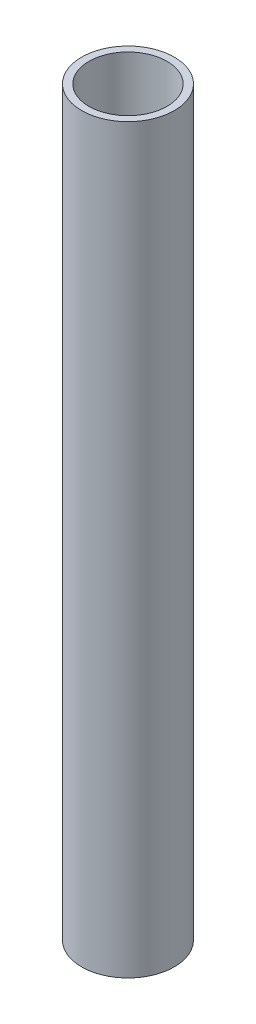
ISO-10303-21;
HEADER;
FILE_DESCRIPTION(('STEP AP214'),'2;1');
FILE_NAME('part.step','',(''),(''),'','','');
FILE_SCHEMA(('AUTOMOTIVE_DESIGN { 1 0 10303 214 1 1 1 1 }'));
ENDSEC;
DATA;
#1=APPLICATION_CONTEXT('core data for automotive mechanical design processes');
#2=APPLICATION_PROTOCOL_DEFINITION('international standard','automotive_design',2000,#1);
#3=PRODUCT_CONTEXT('',#1,'mechanical');
#4=PRODUCT('Part','Part','',(#3));
#5=PRODUCT_RELATED_PRODUCT_CATEGORY('part','',(#4));
#6=PRODUCT_DEFINITION_FORMATION('','',#4);
#7=PRODUCT_DEFINITION_CONTEXT('part definition',#1,'design');
#8=PRODUCT_DEFINITION('design','',#6,#7);
#9=PRODUCT_DEFINITION_SHAPE('','',#8);
#10=(LENGTH_UNIT() NAMED_UNIT(*) SI_UNIT(.MILLI.,.METRE.));
#11=(NAMED_UNIT(*) PLANE_ANGLE_UNIT() SI_UNIT($,.RADIAN.));
#12=(NAMED_UNIT(*) SI_UNIT($,.STERADIAN.) SOLID_ANGLE_UNIT());
#13=UNCERTAINTY_MEASURE_WITH_UNIT(LENGTH_MEASURE(1.E-05),#10,'distance_accuracy_value','');
#14=(GEOMETRIC_REPRESENTATION_CONTEXT(3) GLOBAL_UNCERTAINTY_ASSIGNED_CONTEXT((#13)) GLOBAL_UNIT_ASSIGNED_CONTEXT((#10,
#11,#12)) REPRESENTATION_CONTEXT('',''));
#15=CARTESIAN_POINT('',(0.,0.,0.));
#16=DIRECTION('',(0.,0.,1.));
#17=DIRECTION('',(1.,0.,0.));
#18=AXIS2_PLACEMENT_3D('',#15,#16,#17);
#19=CARTESIAN_POINT('',(0.,101.6,0.));
#20=DIRECTION('',(0.,1.,0.));
#21=DIRECTION('',(0.,0.,1.));
#22=AXIS2_PLACEMENT_3D('',#19,#20,#21);
#23=PLANE('',#22);
#24=CARTESIAN_POINT('',(0.,101.6,0.));
#25=DIRECTION('',(0.,1.,0.));
#26=DIRECTION('',(0.,0.,1.));
#27=AXIS2_PLACEMENT_3D('',#24,#25,#26);
#28=CIRCLE('',#27,6.35);
#29=CARTESIAN_POINT('',(0.,101.6,6.35));
#30=VERTEX_POINT('',#29);
#31=EDGE_CURVE('E10',#30,#30,#28,.T.);
#32=ORIENTED_EDGE('',*,*,#31,.T.);
#33=EDGE_LOOP('',(#32));
#34=FACE_BOUND('',#33,.T.);
#35=CARTESIAN_POINT('',(0.,101.6,0.));
#36=DIRECTION('',(0.,1.,0.));
#37=DIRECTION('',(0.,0.,1.));
#38=AXIS2_PLACEMENT_3D('',#35,#36,#37);
#39=CIRCLE('',#38,5.35);
#40=CARTESIAN_POINT('',(0.,101.6,5.35));
#41=VERTEX_POINT('',#40);
#42=EDGE_CURVE('E45',#41,#41,#39,.T.);
#43=ORIENTED_EDGE('',*,*,#42,.F.);
#44=EDGE_LOOP('',(#43));
#45=FACE_BOUND('',#44,.T.);
#46=ADVANCED_FACE('F34',(#34,#45),#23,.T.);
#47=CARTESIAN_POINT('',(0.,0.,0.));
#48=DIRECTION('',(0.,1.,0.));
#49=DIRECTION('',(0.,0.,1.));
#50=AXIS2_PLACEMENT_3D('',#47,#48,#49);
#51=PLANE('',#50);
#52=CARTESIAN_POINT('',(0.,0.,0.));
#53=DIRECTION('',(0.,1.,0.));
#54=DIRECTION('',(0.,0.,1.));
#55=AXIS2_PLACEMENT_3D('',#52,#53,#54);
#56=CIRCLE('',#55,6.35);
#57=CARTESIAN_POINT('',(0.,0.,6.35));
#58=VERTEX_POINT('',#57);
#59=EDGE_CURVE('E38',#58,#58,#56,.T.);
#60=ORIENTED_EDGE('',*,*,#59,.F.);
#61=EDGE_LOOP('',(#60));
#62=FACE_BOUND('',#61,.T.);
#63=CARTESIAN_POINT('',(0.,0.,0.));
#64=DIRECTION('',(0.,1.,0.));
#65=DIRECTION('',(0.,0.,1.));
#66=AXIS2_PLACEMENT_3D('',#63,#64,#65);
#67=CIRCLE('',#66,5.35);
#68=CARTESIAN_POINT('',(0.,0.,5.35));
#69=VERTEX_POINT('',#68);
#70=EDGE_CURVE('E47',#69,#69,#67,.T.);
#71=ORIENTED_EDGE('',*,*,#70,.T.);
#72=EDGE_LOOP('',(#71));
#73=FACE_BOUND('',#72,.T.);
#74=ADVANCED_FACE('F57',(#62,#73),#51,.F.);
#75=CARTESIAN_POINT('',(0.,101.6,0.));
#76=DIRECTION('',(0.,-1.,0.));
#77=DIRECTION('',(0.,0.,-1.));
#78=AXIS2_PLACEMENT_3D('',#75,#76,#77);
#79=CYLINDRICAL_SURFACE('',#78,6.35);
#80=ORIENTED_EDGE('',*,*,#31,.F.);
#81=EDGE_LOOP('',(#80));
#82=FACE_BOUND('',#81,.T.);
#83=ORIENTED_EDGE('',*,*,#59,.T.);
#84=EDGE_LOOP('',(#83));
#85=FACE_BOUND('',#84,.T.);
#86=ADVANCED_FACE('F36',(#82,#85),#79,.T.);
#87=CARTESIAN_POINT('',(0.,101.6,0.));
#88=DIRECTION('',(0.,-1.,0.));
#89=DIRECTION('',(0.,0.,-1.));
#90=AXIS2_PLACEMENT_3D('',#87,#88,#89);
#91=CYLINDRICAL_SURFACE('',#90,5.35);
#92=ORIENTED_EDGE('',*,*,#42,.T.);
#93=EDGE_LOOP('',(#92));
#94=FACE_BOUND('',#93,.T.);
#95=ORIENTED_EDGE('',*,*,#70,.F.);
#96=EDGE_LOOP('',(#95));
#97=FACE_BOUND('',#96,.T.);
#98=ADVANCED_FACE('F53',(#94,#97),#91,.F.);
#99=CLOSED_SHELL('',(#46,#74,#86,#98));
#100=MANIFOLD_SOLID_BREP('B2',#99);
#101=ADVANCED_BREP_SHAPE_REPRESENTATION('',(#18,#100),#14);
#102=SHAPE_DEFINITION_REPRESENTATION(#9,#101);
ENDSEC;
END-ISO-10303-21;
